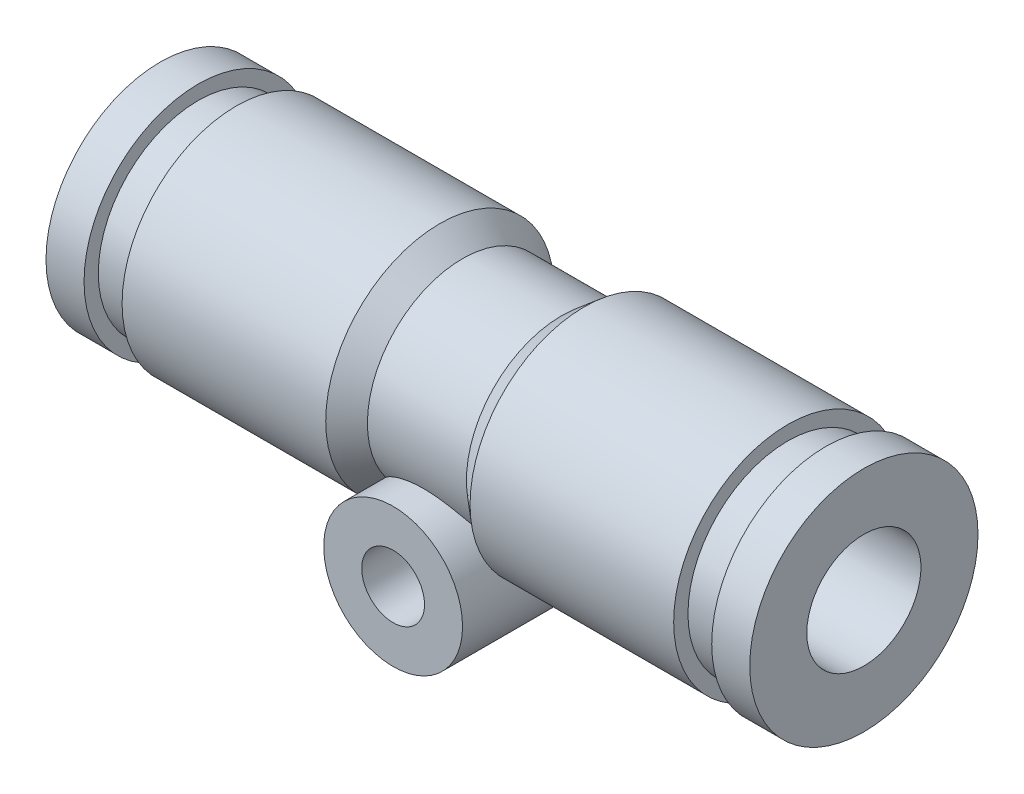
ISO-10303-21;
HEADER;
FILE_DESCRIPTION(('STEP AP214'),'2;1');
FILE_NAME('part.step','',(''),(''),'','','');
FILE_SCHEMA(('AUTOMOTIVE_DESIGN { 1 0 10303 214 1 1 1 1 }'));
ENDSEC;
DATA;
#1=APPLICATION_CONTEXT('core data for automotive mechanical design processes');
#2=APPLICATION_PROTOCOL_DEFINITION('international standard','automotive_design',2000,#1);
#3=PRODUCT_CONTEXT('',#1,'mechanical');
#4=PRODUCT('Part','Part','',(#3));
#5=PRODUCT_RELATED_PRODUCT_CATEGORY('part','',(#4));
#6=PRODUCT_DEFINITION_FORMATION('','',#4);
#7=PRODUCT_DEFINITION_CONTEXT('part definition',#1,'design');
#8=PRODUCT_DEFINITION('design','',#6,#7);
#9=PRODUCT_DEFINITION_SHAPE('','',#8);
#10=(LENGTH_UNIT() NAMED_UNIT(*) SI_UNIT(.MILLI.,.METRE.));
#11=(NAMED_UNIT(*) PLANE_ANGLE_UNIT() SI_UNIT($,.RADIAN.));
#12=(NAMED_UNIT(*) SI_UNIT($,.STERADIAN.) SOLID_ANGLE_UNIT());
#13=UNCERTAINTY_MEASURE_WITH_UNIT(LENGTH_MEASURE(1.E-05),#10,'distance_accuracy_value','');
#14=(GEOMETRIC_REPRESENTATION_CONTEXT(3) GLOBAL_UNCERTAINTY_ASSIGNED_CONTEXT((#13)) GLOBAL_UNIT_ASSIGNED_CONTEXT((#10,
#11,#12)) REPRESENTATION_CONTEXT('',''));
#15=CARTESIAN_POINT('',(0.,0.,0.));
#16=DIRECTION('',(0.,0.,1.));
#17=DIRECTION('',(1.,0.,0.));
#18=AXIS2_PLACEMENT_3D('',#15,#16,#17);
#19=CARTESIAN_POINT('',(0.,0.,0.));
#20=DIRECTION('',(-1.,0.,0.));
#21=DIRECTION('',(0.,0.,1.));
#22=AXIS2_PLACEMENT_3D('',#19,#20,#21);
#23=CYLINDRICAL_SURFACE('',#22,3.);
#24=CARTESIAN_POINT('',(-18.5,0.,0.));
#25=DIRECTION('',(-1.,0.,0.));
#26=DIRECTION('',(0.,0.,1.));
#27=AXIS2_PLACEMENT_3D('',#24,#25,#26);
#28=CIRCLE('',#27,3.);
#29=CARTESIAN_POINT('',(-18.5,0.,3.));
#30=VERTEX_POINT('',#29);
#31=EDGE_CURVE('E28',#30,#30,#28,.T.);
#32=ORIENTED_EDGE('',*,*,#31,.T.);
#33=EDGE_LOOP('',(#32));
#34=FACE_BOUND('',#33,.T.);
#35=CARTESIAN_POINT('',(-0.999999999999997,0.,0.));
#36=DIRECTION('',(-1.,0.,0.));
#37=DIRECTION('',(0.,0.,1.));
#38=AXIS2_PLACEMENT_3D('',#35,#36,#37);
#39=CIRCLE('',#38,3.);
#40=CARTESIAN_POINT('',(-0.999999999999997,0.,3.));
#41=VERTEX_POINT('',#40);
#42=EDGE_CURVE('E98',#41,#41,#39,.T.);
#43=ORIENTED_EDGE('',*,*,#42,.F.);
#44=EDGE_LOOP('',(#43));
#45=FACE_BOUND('',#44,.T.);
#46=ADVANCED_FACE('F16',(#34,#45),#23,.F.);
#47=CARTESIAN_POINT('',(-0.999999999999997,-1.25,0.));
#48=DIRECTION('',(-1.,0.,0.));
#49=DIRECTION('',(0.,0.,1.));
#50=AXIS2_PLACEMENT_3D('',#47,#48,#49);
#51=PLANE('',#50);
#52=CARTESIAN_POINT('',(-0.999999999999997,0.,0.));
#53=DIRECTION('',(-1.,0.,0.));
#54=DIRECTION('',(0.,0.,1.));
#55=AXIS2_PLACEMENT_3D('',#52,#53,#54);
#56=CIRCLE('',#55,1.25);
#57=CARTESIAN_POINT('',(-0.999999999999997,0.,1.25));
#58=VERTEX_POINT('',#57);
#59=EDGE_CURVE('E92',#58,#58,#56,.T.);
#60=ORIENTED_EDGE('',*,*,#59,.F.);
#61=EDGE_LOOP('',(#60));
#62=FACE_BOUND('',#61,.T.);
#63=ORIENTED_EDGE('',*,*,#42,.T.);
#64=EDGE_LOOP('',(#63));
#65=FACE_BOUND('',#64,.T.);
#66=ADVANCED_FACE('F118',(#62,#65),#51,.T.);
#67=CARTESIAN_POINT('',(0.999999999999997,-3.,0.));
#68=DIRECTION('',(1.,0.,0.));
#69=DIRECTION('',(0.,0.,-1.));
#70=AXIS2_PLACEMENT_3D('',#67,#68,#69);
#71=PLANE('',#70);
#72=CARTESIAN_POINT('',(0.999999999999997,0.,0.));
#73=DIRECTION('',(-1.,0.,0.));
#74=DIRECTION('',(0.,0.,1.));
#75=AXIS2_PLACEMENT_3D('',#72,#73,#74);
#76=CIRCLE('',#75,1.25);
#77=CARTESIAN_POINT('',(0.999999999999997,0.,1.25));
#78=VERTEX_POINT('',#77);
#79=EDGE_CURVE('E95',#78,#78,#76,.T.);
#80=ORIENTED_EDGE('',*,*,#79,.T.);
#81=EDGE_LOOP('',(#80));
#82=FACE_BOUND('',#81,.T.);
#83=CARTESIAN_POINT('',(0.999999999999997,0.,0.));
#84=DIRECTION('',(-1.,0.,0.));
#85=DIRECTION('',(0.,0.,1.));
#86=AXIS2_PLACEMENT_3D('',#83,#84,#85);
#87=CIRCLE('',#86,3.);
#88=CARTESIAN_POINT('',(0.999999999999997,0.,3.));
#89=VERTEX_POINT('',#88);
#90=EDGE_CURVE('E90',#89,#89,#87,.T.);
#91=ORIENTED_EDGE('',*,*,#90,.F.);
#92=EDGE_LOOP('',(#91));
#93=FACE_BOUND('',#92,.T.);
#94=ADVANCED_FACE('F123',(#82,#93),#71,.T.);
#95=CARTESIAN_POINT('',(0.,0.,0.));
#96=DIRECTION('',(-1.,0.,0.));
#97=DIRECTION('',(0.,0.,1.));
#98=AXIS2_PLACEMENT_3D('',#95,#96,#97);
#99=CYLINDRICAL_SURFACE('',#98,3.);
#100=CARTESIAN_POINT('',(18.5,0.,0.));
#101=DIRECTION('',(-1.,0.,0.));
#102=DIRECTION('',(0.,0.,1.));
#103=AXIS2_PLACEMENT_3D('',#100,#101,#102);
#104=CIRCLE('',#103,3.);
#105=CARTESIAN_POINT('',(18.5,0.,3.));
#106=VERTEX_POINT('',#105);
#107=EDGE_CURVE('E88',#106,#106,#104,.T.);
#108=ORIENTED_EDGE('',*,*,#107,.F.);
#109=EDGE_LOOP('',(#108));
#110=FACE_BOUND('',#109,.T.);
#111=ORIENTED_EDGE('',*,*,#90,.T.);
#112=EDGE_LOOP('',(#111));
#113=FACE_BOUND('',#112,.T.);
#114=ADVANCED_FACE('F127',(#110,#113),#99,.F.);
#115=CARTESIAN_POINT('',(2.60240273593462,0.,0.));
#116=DIRECTION('',(1.,0.,0.));
#117=DIRECTION('',(0.,0.,-1.));
#118=AXIS2_PLACEMENT_3D('',#115,#116,#117);
#119=CONICAL_SURFACE('',#118,5.,0.698131700797734);
#120=CARTESIAN_POINT('',(3.79415632852883,0.,0.));
#121=DIRECTION('',(-1.,0.,0.));
#122=DIRECTION('',(0.,0.,1.));
#123=AXIS2_PLACEMENT_3D('',#120,#121,#122);
#124=CIRCLE('',#123,6.);
#125=CARTESIAN_POINT('',(3.79415632852883,0.,6.));
#126=VERTEX_POINT('',#125);
#127=EDGE_CURVE('E62',#126,#126,#124,.T.);
#128=ORIENTED_EDGE('',*,*,#127,.T.);
#129=EDGE_LOOP('',(#128));
#130=FACE_BOUND('',#129,.T.);
#131=CARTESIAN_POINT('',(2.60240273593462,0.,0.));
#132=DIRECTION('',(-1.,0.,0.));
#133=DIRECTION('',(0.,0.,1.));
#134=AXIS2_PLACEMENT_3D('',#131,#132,#133);
#135=CIRCLE('',#134,5.);
#136=CARTESIAN_POINT('',(2.60240273593462,-2.94070322158605,4.04379333825968));
#137=VERTEX_POINT('',#136);
#138=CARTESIAN_POINT('',(2.60240273593462,-2.94070322158605,-4.04379333825968));
#139=VERTEX_POINT('',#138);
#140=EDGE_CURVE('E57',#137,#139,#135,.T.);
#141=ORIENTED_EDGE('',*,*,#140,.F.);
#142=CARTESIAN_POINT('',(2.49744300952812,-2.83818137091215,4.00896076898988));
#143=CARTESIAN_POINT('',(2.53501750418707,-2.87343508961016,4.02262900383667));
#144=CARTESIAN_POINT('',(2.57210826251721,-2.90973367427727,4.03490478411134));
#145=CARTESIAN_POINT('',(2.64516786340097,-2.98438443938821,4.0563722232218));
#146=CARTESIAN_POINT('',(2.68113559150554,-3.02273856319636,4.0655609015829));
#147=CARTESIAN_POINT('',(2.7872300444597,-3.14096495133667,4.08805634389488));
#148=CARTESIAN_POINT('',(2.85531611531836,-3.22378500759988,4.09620513600153));
#149=CARTESIAN_POINT('',(2.98429148066433,-3.39569179818134,4.09644402968397));
#150=CARTESIAN_POINT('',(3.0451368609858,-3.48481201504061,4.08844095451283));
#151=CARTESIAN_POINT('',(3.15724988980957,-3.6654608866603,4.05500338067057));
#152=CARTESIAN_POINT('',(3.20854442438163,-3.75698192702457,4.0296187851381));
#153=CARTESIAN_POINT('',(3.29749529388649,-3.93220272676524,3.96450131569345));
#154=CARTESIAN_POINT('',(3.33587616594083,-4.01598363484378,3.92595790982199));
#155=CARTESIAN_POINT('',(3.40415391928817,-4.18009152586392,3.83599776527154));
#156=CARTESIAN_POINT('',(3.43403840092769,-4.26041331707905,3.78456241580369));
#157=CARTESIAN_POINT('',(3.49584292870839,-4.44444523929988,3.64995854714985));
#158=CARTESIAN_POINT('',(3.52442960233741,-4.54582135746169,3.56208878975451));
#159=CARTESIAN_POINT('',(3.57060621493688,-4.73648630963507,3.37161750312203));
#160=CARTESIAN_POINT('',(3.58817463816042,-4.82575122907248,3.26898762844836));
#161=CARTESIAN_POINT('',(3.61218375196865,-4.97206184822482,3.07901040980296));
#162=CARTESIAN_POINT('',(3.62027720622642,-5.03172121878027,2.99383324015471));
#163=CARTESIAN_POINT('',(3.63304652084302,-5.14408528747018,2.818725139703));
#164=CARTESIAN_POINT('',(3.63772058392586,-5.19678631630221,2.72879173555132));
#165=CARTESIAN_POINT('',(3.64460807110085,-5.2955825562105,2.54511488831913));
#166=CARTESIAN_POINT('',(3.64681742697528,-5.3416667366994,2.45136540999105));
#167=CARTESIAN_POINT('',(3.64953110913271,-5.42746958618297,2.26096244544423));
#168=CARTESIAN_POINT('',(3.6500349121993,-5.46718629825556,2.16430807725801));
#169=CARTESIAN_POINT('',(3.64994182872684,-5.55956407798054,1.91804561170994));
#170=CARTESIAN_POINT('',(3.64863946225077,-5.60827093662262,1.76694624840167));
#171=CARTESIAN_POINT('',(3.64515791696607,-5.69259412530791,1.461127029615));
#172=CARTESIAN_POINT('',(3.64297831019459,-5.72820404974301,1.30640544177848));
#173=CARTESIAN_POINT('',(3.63882013259333,-5.78697692577252,0.994475637312486));
#174=CARTESIAN_POINT('',(3.63684175154837,-5.81012821376136,0.837265231902721));
#175=CARTESIAN_POINT('',(3.63376196155267,-5.8443346580604,0.521564457018854));
#176=CARTESIAN_POINT('',(3.63266040261534,-5.85539188326602,0.363074311140703));
#177=CARTESIAN_POINT('',(3.63163234521959,-5.86575371374293,0.0412124786688938));
#178=CARTESIAN_POINT('',(3.63174000470868,-5.86471664908859,-0.122170351232936));
#179=CARTESIAN_POINT('',(3.63318399983668,-5.85004149934189,-0.448397826548533));
#180=CARTESIAN_POINT('',(3.63452055921515,-5.83640111962571,-0.611242368540477));
#181=CARTESIAN_POINT('',(3.63801004363454,-5.7962904564564,-0.935158186539589));
#182=CARTESIAN_POINT('',(3.64016206244485,-5.76983440617097,-1.09623122750467));
#183=CARTESIAN_POINT('',(3.64446880143453,-5.70361376796655,-1.41559224160734));
#184=CARTESIAN_POINT('',(3.64662352006533,-5.66385487554975,-1.57388137617598));
#185=CARTESIAN_POINT('',(3.64910068679437,-5.58651732721466,-1.83204458201322));
#186=CARTESIAN_POINT('',(3.64979946423505,-5.55296787317778,-1.93313245080637));
#187=CARTESIAN_POINT('',(3.65012789552069,-5.47959807335785,-2.13299949166707));
#188=CARTESIAN_POINT('',(3.64975779813376,-5.43977918875084,-2.23177919553873));
#189=CARTESIAN_POINT('',(3.64731714412769,-5.35358759801863,-2.42632071197188));
#190=CARTESIAN_POINT('',(3.64524826308699,-5.30722138708189,-2.52208540176093));
#191=CARTESIAN_POINT('',(3.63860953443154,-5.20758216844159,-2.7098300235428));
#192=CARTESIAN_POINT('',(3.63404055333255,-5.15431155862936,-2.80181125498459));
#193=CARTESIAN_POINT('',(3.61895200842227,-5.01827072323123,-3.01597397930093));
#194=CARTESIAN_POINT('',(3.60680619551761,-4.93210045228504,-3.13593514822385));
#195=CARTESIAN_POINT('',(3.57236643864194,-4.74522030625738,-3.36236483623995));
#196=CARTESIAN_POINT('',(3.55008967542119,-4.64453524298676,-3.46885580979177));
#197=CARTESIAN_POINT('',(3.49847569948111,-4.45586254291758,-3.63884667553587));
#198=CARTESIAN_POINT('',(3.47220273062776,-4.37080209672166,-3.70648865485246));
#199=CARTESIAN_POINT('',(3.40980067586467,-4.19444346556984,-3.82769258683602));
#200=CARTESIAN_POINT('',(3.37368147324241,-4.10315160399353,-3.88126855315067));
#201=CARTESIAN_POINT('',(3.29017096164279,-3.9164002959484,-3.97184414467173));
#202=CARTESIAN_POINT('',(3.24269376275994,-3.82091385427079,-4.0087109465928));
#203=CARTESIAN_POINT('',(3.13680006836322,-3.63055708866317,-4.06351045408079));
#204=CARTESIAN_POINT('',(3.07838544166453,-3.53568666233919,-4.08144639078577));
#205=CARTESIAN_POINT('',(2.95951793934521,-3.36140231208487,-4.09779266541949));
#206=CARTESIAN_POINT('',(2.90007660270723,-3.28146745267984,-4.09821582281753));
#207=CARTESIAN_POINT('',(2.77540135321448,-3.12735078523216,-4.08602815177606));
#208=CARTESIAN_POINT('',(2.71016773330866,-3.05316868659452,-4.07341798216373));
#209=CARTESIAN_POINT('',(2.61909220434669,-2.95754947057032,-4.04887659914003));
#210=CARTESIAN_POINT('',(2.59504690563153,-2.93301627347318,-4.04177637612477));
#211=CARTESIAN_POINT('',(2.54655180928172,-2.88490280423067,-4.02630240294381));
#212=CARTESIAN_POINT('',(2.52210326530158,-2.86132015923841,-4.01793210918921));
#213=CARTESIAN_POINT('',(2.49744300952808,-2.83818137091211,-4.00896076898986));
#214=B_SPLINE_CURVE_WITH_KNOTS('',3,(#142,#143,#144,#145,#146,#147,#148,#149,#150,#151,#152,
#153,#154,#155,#156,#157,#158,#159,#160,#161,#162,#163,#164,#165,#166,#167,#168,#169,#170,#171,
#172,#173,#174,#175,#176,#177,#178,#179,#180,#181,#182,#183,#184,#185,#186,#187,#188,#189,#190,
#191,#192,#193,#194,#195,#196,#197,#198,#199,#200,#201,#202,#203,#204,#205,#206,#207,#208,#209,
#210,#211,#212,#213),.UNSPECIFIED.,.F.,.F.,(4,2,2,2,2,2,2,2,2,2,2,2,2,2,2,2,2,2,2,2,2,2,2,2,2,2,
2,2,2,2,2,2,2,2,2,4),(0.,0.159861657195411,0.319877213922793,0.640885041432728,
0.963749988909762,1.28569184180627,1.58401129623719,1.88276390983401,2.29198571781765,
2.70200416048555,3.01451092696199,3.32718183322991,3.64036807044289,3.95365037582539,
4.42923999617566,4.90506191533546,5.38132852094173,5.85751364028413,6.34718307534837,
6.8369416796985,7.32615759767635,7.81516432934133,8.13451621891985,8.4537937890716,
8.77275682070262,9.09160937212112,9.53487640939303,9.97739451160665,10.3115628707665,
10.6453970313007,10.9818402413165,11.3182260175949,11.6158273906529,11.9134137208684,
12.0186226637276,12.1235502593469),.UNSPECIFIED.);
#215=EDGE_CURVE('E60',#137,#139,#214,.T.);
#216=ORIENTED_EDGE('',*,*,#215,.T.);
#217=EDGE_LOOP('',(#141,#216));
#218=FACE_BOUND('',#217,.T.);
#219=ADVANCED_FACE('F132',(#130,#218),#119,.T.);
#220=CARTESIAN_POINT('',(0.,0.,0.));
#221=DIRECTION('',(-1.,0.,0.));
#222=DIRECTION('',(0.,0.,1.));
#223=AXIS2_PLACEMENT_3D('',#220,#221,#222);
#224=CYLINDRICAL_SURFACE('',#223,5.);
#225=ORIENTED_EDGE('',*,*,#140,.T.);
#226=CARTESIAN_POINT('',(3.61559123795818,-5.,0.));
#227=CARTESIAN_POINT('',(3.61559392836513,-4.99999866396236,-0.155457231632362));
#228=CARTESIAN_POINT('',(3.61461037725635,-4.99274075629188,-0.310974476555238));
#229=CARTESIAN_POINT('',(3.61042342612615,-4.9637619832313,-0.620719266113124));
#230=CARTESIAN_POINT('',(3.60721828070504,-4.94202974658309,-0.774945700131604));
#231=CARTESIAN_POINT('',(3.59780038768312,-4.88421303799708,-1.08111274387874));
#232=CARTESIAN_POINT('',(3.59157811139265,-4.84808316034094,-1.23304452844771));
#233=CARTESIAN_POINT('',(3.57485468569958,-4.76186613359081,-1.53261535223179));
#234=CARTESIAN_POINT('',(3.56435499858971,-4.71178375620207,-1.68025584002544));
#235=CARTESIAN_POINT('',(3.538898317125,-4.60481511859157,-1.95310399306702));
#236=CARTESIAN_POINT('',(3.52459251455064,-4.54937295937857,-2.07893931811156));
#237=CARTESIAN_POINT('',(3.4898044120678,-4.42868842736107,-2.32496959725506));
#238=CARTESIAN_POINT('',(3.46932173498715,-4.3634454562217,-2.44516420640266));
#239=CARTESIAN_POINT('',(3.42062053434761,-4.22435728823172,-2.67827645728095));
#240=CARTESIAN_POINT('',(3.39242841147254,-4.15054193468432,-2.79121733803476));
#241=CARTESIAN_POINT('',(3.32657184692375,-3.99550719630739,-3.00894503767932));
#242=CARTESIAN_POINT('',(3.28891240510304,-3.91429173399058,-3.11373612248777));
#243=CARTESIAN_POINT('',(3.21611033425859,-3.77276985437259,-3.28241517190016));
#244=CARTESIAN_POINT('',(3.18389856529676,-3.71391701102772,-3.34880521636752));
#245=CARTESIAN_POINT('',(3.11383032029431,-3.59438813600444,-3.47678456636732));
#246=CARTESIAN_POINT('',(3.0759751653722,-3.53371253368195,-3.53837499036765));
#247=CARTESIAN_POINT('',(2.9942934851908,-3.41143376833593,-3.65641081901893));
#248=CARTESIAN_POINT('',(2.9504693886655,-3.34983099159724,-3.71285830079762));
#249=CARTESIAN_POINT('',(2.85663424578769,-3.22664695242005,-3.82039716097935));
#250=CARTESIAN_POINT('',(2.80662298602488,-3.16506569079717,-3.87148835451865));
#251=CARTESIAN_POINT('',(2.70017727112448,-3.04273742181057,-3.96835734612463));
#252=CARTESIAN_POINT('',(2.64371966249634,-2.98199435965761,-4.01411471717468));
#253=CARTESIAN_POINT('',(2.52466515164763,-2.86263965775499,-4.10008599557794));
#254=CARTESIAN_POINT('',(2.46206841017621,-2.80402796225194,-4.140300048013));
#255=CARTESIAN_POINT('',(2.33101418555348,-2.68994268522528,-4.21531402432909));
#256=CARTESIAN_POINT('',(2.26255539041184,-2.63446981084151,-4.25011273126212));
#257=CARTESIAN_POINT('',(2.12022165310462,-2.52761400382818,-4.31451748210914));
#258=CARTESIAN_POINT('',(2.04634687748925,-2.47623094553139,-4.34412368560616));
#259=CARTESIAN_POINT('',(1.89837909901268,-2.3813617698121,-4.39680329395962));
#260=CARTESIAN_POINT('',(1.82457434330042,-2.33758512702422,-4.42016504979831));
#261=CARTESIAN_POINT('',(1.67313934467556,-2.25491934370792,-4.46290326519465));
#262=CARTESIAN_POINT('',(1.59550786804239,-2.21603179394198,-4.48227842893484));
#263=CARTESIAN_POINT('',(1.43699950167707,-2.14364448986514,-4.51734504745697));
#264=CARTESIAN_POINT('',(1.35612349358654,-2.11014328414031,-4.53303749511583));
#265=CARTESIAN_POINT('',(1.19162718998943,-2.04887970552361,-4.56105552030421));
#266=CARTESIAN_POINT('',(1.10800586557499,-2.02111951340696,-4.57337981898172));
#267=CARTESIAN_POINT('',(0.936152095418676,-1.97092609574487,-4.59523908047158));
#268=CARTESIAN_POINT('',(0.84785623851784,-1.94867027817371,-4.60468300016214));
#269=CARTESIAN_POINT('',(0.66955723440838,-1.91077957819877,-4.62053498140425));
#270=CARTESIAN_POINT('',(0.579553504641636,-1.89514699900353,-4.62694198697112));
#271=CARTESIAN_POINT('',(0.398471073457957,-1.87066556045264,-4.63689392361183));
#272=CARTESIAN_POINT('',(0.307392359029185,-1.86181678329522,-4.640438820006));
#273=CARTESIAN_POINT('',(0.124761828135672,-1.85098603544662,-4.64476959070513));
#274=CARTESIAN_POINT('',(0.0332100027105565,-1.84900419529107,-4.64555541256204));
#275=CARTESIAN_POINT('',(-0.153059700365814,-1.85197896520038,-4.6443705134828));
#276=CARTESIAN_POINT('',(-0.247773034576832,-1.85718765926803,-4.64229964531536));
#277=CARTESIAN_POINT('',(-0.436363737220321,-1.87494078997109,-4.6351578318012));
#278=CARTESIAN_POINT('',(-0.530241372647507,-1.88748279157443,-4.6300878822959));
#279=CARTESIAN_POINT('',(-0.716567524862344,-1.91978006769912,-4.61678994329093));
#280=CARTESIAN_POINT('',(-0.809015356368987,-1.93953869578025,-4.6085604854795));
#281=CARTESIAN_POINT('',(-0.991725288828305,-1.98604732633018,-4.5887094564556));
#282=CARTESIAN_POINT('',(-1.08198825413691,-2.01279451297529,-4.57708925122028));
#283=CARTESIAN_POINT('',(-1.25965154812003,-2.07296488962359,-4.55015404043024));
#284=CARTESIAN_POINT('',(-1.34705311369296,-2.10638514949147,-4.53484065593311));
#285=CARTESIAN_POINT('',(-1.51832853672154,-2.17948139938541,-4.5001661469714));
#286=CARTESIAN_POINT('',(-1.60220379283209,-2.21915487894519,-4.48080664587986));
#287=CARTESIAN_POINT('',(-1.76578785801998,-2.30422314346795,-4.4376602216486));
#288=CARTESIAN_POINT('',(-1.84549768371003,-2.34961652312209,-4.41387438532268));
#289=CARTESIAN_POINT('',(-2.00015148787307,-2.44546748637292,-4.36149850380934));
#290=CARTESIAN_POINT('',(-2.07509567869436,-2.49592484406899,-4.33290867288652));
#291=CARTESIAN_POINT('',(-2.21689372613641,-2.59909093956573,-4.2717888693983));
#292=CARTESIAN_POINT('',(-2.28394755926951,-2.65163929968223,-4.23945187711831));
#293=CARTESIAN_POINT('',(-2.41275260234536,-2.75988974730383,-4.16979026323232));
#294=CARTESIAN_POINT('',(-2.47450202564161,-2.81559288700972,-4.13246397185264));
#295=CARTESIAN_POINT('',(-2.59233820785671,-2.92920682661712,-4.05272241910852));
#296=CARTESIAN_POINT('',(-2.64842848619343,-2.98711622318877,-4.01031035695221));
#297=CARTESIAN_POINT('',(-2.75484855027419,-3.10425899283475,-3.92033576932669));
#298=CARTESIAN_POINT('',(-2.80517620018365,-3.16349284714016,-3.87277134683895));
#299=CARTESIAN_POINT('',(-2.89890819199506,-3.28091449368538,-3.77377151082156));
#300=CARTESIAN_POINT('',(-2.9424482852676,-3.33909383077758,-3.72245447190469));
#301=CARTESIAN_POINT('',(-3.02413185187595,-3.45496733551345,-3.61516999941971));
#302=CARTESIAN_POINT('',(-3.06227340734468,-3.51266132392165,-3.55920092433623));
#303=CARTESIAN_POINT('',(-3.16890977770537,-3.68380827989724,-3.38466984370044));
#304=CARTESIAN_POINT('',(-3.22966872198657,-3.79539428951194,-3.25942767851332));
#305=CARTESIAN_POINT('',(-3.33781074862885,-4.01739225509893,-2.9824144695438));
#306=CARTESIAN_POINT('',(-3.38358406989687,-4.12686933914501,-2.82928615130687));
#307=CARTESIAN_POINT('',(-3.45883628959411,-4.32925887683519,-2.5086812159727));
#308=CARTESIAN_POINT('',(-3.48830492796947,-4.42216087541632,-2.34119564065375));
#309=CARTESIAN_POINT('',(-3.52587672049576,-4.55484406424309,-2.06554333895026));
#310=CARTESIAN_POINT('',(-3.53779925945988,-4.60090055257707,-1.96082560758362));
#311=CARTESIAN_POINT('',(-3.55830559912619,-4.68582893829457,-1.74817093601044));
#312=CARTESIAN_POINT('',(-3.5668890645619,-4.7247001140166,-1.64023367371123));
#313=CARTESIAN_POINT('',(-3.58144333249171,-4.79498101608284,-1.42173810781208));
#314=CARTESIAN_POINT('',(-3.5874129093717,-4.82638723907151,-1.31117860023655));
#315=CARTESIAN_POINT('',(-3.59732889556528,-4.88152716118984,-1.0880708651819));
#316=CARTESIAN_POINT('',(-3.60127517713173,-4.90526037582495,-0.975522512594762));
#317=CARTESIAN_POINT('',(-3.60810060679576,-4.94804331749473,-0.731150854730216));
#318=CARTESIAN_POINT('',(-3.61071348790874,-4.96576507877384,-0.599085756349465));
#319=CARTESIAN_POINT('',(-3.61430239148231,-4.99061356143543,-0.333933200295242));
#320=CARTESIAN_POINT('',(-3.61527825153673,-4.9977392315892,-0.200845642500855));
#321=CARTESIAN_POINT('',(-3.61577759853996,-5.00134553614766,0.0655540604669429));
#322=CARTESIAN_POINT('',(-3.61530025375918,-4.99782007447534,0.198866290592681));
#323=CARTESIAN_POINT('',(-3.61279939399536,-4.98013517006533,0.464766995140445));
#324=CARTESIAN_POINT('',(-3.61077589021604,-4.96597580438258,0.597355474799868));
#325=CARTESIAN_POINT('',(-3.60468493267071,-4.9262669885348,0.866736950168788));
#326=CARTESIAN_POINT('',(-3.60053154717243,-4.90024424693102,1.0034585912426));
#327=CARTESIAN_POINT('',(-3.58940947203136,-4.83692237524988,1.27416872063261));
#328=CARTESIAN_POINT('',(-3.58244047977239,-4.79962203318547,1.40815691353627));
#329=CARTESIAN_POINT('',(-3.56465656968925,-4.71410619926503,1.67226109803404));
#330=CARTESIAN_POINT('',(-3.55384392422128,-4.66589716270366,1.80237932838953));
#331=CARTESIAN_POINT('',(-3.52706055054513,-4.55905584576871,2.05770383115314));
#332=CARTESIAN_POINT('',(-3.51109115381562,-4.50042625774761,2.18291136216047));
#333=CARTESIAN_POINT('',(-3.47660798062919,-4.3871655795525,2.4009281554489));
#334=CARTESIAN_POINT('',(-3.45938190106291,-4.33439053355238,2.49490969429399));
#335=CARTESIAN_POINT('',(-3.41997815751928,-4.22339629237382,2.67851128655262));
#336=CARTESIAN_POINT('',(-3.39780155667296,-4.16517826764007,2.76813227137551));
#337=CARTESIAN_POINT('',(-3.3476654281464,-4.04400192721565,2.94232835379054));
#338=CARTESIAN_POINT('',(-3.31971011521749,-3.98104708752607,3.026907071397));
#339=CARTESIAN_POINT('',(-3.25718085217083,-3.85122419860509,3.1904498027411));
#340=CARTESIAN_POINT('',(-3.22260682085394,-3.78435610137242,3.26941374757983));
#341=CARTESIAN_POINT('',(-3.14574047051557,-3.64714936128267,3.42182884635311));
#342=CARTESIAN_POINT('',(-3.10337831657718,-3.57678389805399,3.49522086796028));
#343=CARTESIAN_POINT('',(-3.01056665592987,-3.43452247174789,3.63510752483649));
#344=CARTESIAN_POINT('',(-2.96011711680147,-3.36262650253621,3.70160213245445));
#345=CARTESIAN_POINT('',(-2.85082918834137,-3.21890056589313,3.82724249666443));
#346=CARTESIAN_POINT('',(-2.79199714740493,-3.14707058954296,3.88639375179499));
#347=CARTESIAN_POINT('',(-2.66587417499562,-3.00508033756522,3.99719927265386));
#348=CARTESIAN_POINT('',(-2.59858467983999,-2.93491978082308,4.04885480816764));
#349=CARTESIAN_POINT('',(-2.46671505223356,-2.80837365321898,4.13739831812852));
#350=CARTESIAN_POINT('',(-2.40328569706114,-2.75151866360814,4.1753370839022));
#351=CARTESIAN_POINT('',(-2.27087334185639,-2.64114352957691,4.24601639847264));
#352=CARTESIAN_POINT('',(-2.20189063326277,-2.58762321041496,4.27875721978865));
#353=CARTESIAN_POINT('',(-2.05880988385994,-2.484777688467,4.33929065206399));
#354=CARTESIAN_POINT('',(-1.98471139733715,-2.43545285205133,4.36708283111459));
#355=CARTESIAN_POINT('',(-1.83193753721114,-2.3417510794232,4.41803655330558));
#356=CARTESIAN_POINT('',(-1.75326211309541,-2.29737419783368,4.44119804532776));
#357=CARTESIAN_POINT('',(-1.5954295053418,-2.21600262439178,4.48233452096926));
#358=CARTESIAN_POINT('',(-1.51644174444935,-2.17877097548935,4.50049111385609));
#359=CARTESIAN_POINT('',(-1.35536197223948,-2.10983994155072,4.53321335321118));
#360=CARTESIAN_POINT('',(-1.27326896187355,-2.07814235572139,4.54777783246214));
#361=CARTESIAN_POINT('',(-1.0232112932695,-1.99193327875088,4.58652807201476));
#362=CARTESIAN_POINT('',(-0.851325219039576,-1.946231446405,4.60580621908193));
#363=CARTESIAN_POINT('',(-0.494730622295063,-1.87893796146454,4.63367870285096));
#364=CARTESIAN_POINT('',(-0.30978594134934,-1.85842447271344,4.64179695207392));
#365=CARTESIAN_POINT('',(0.061372867483442,-1.84580340128353,4.64683566392483));
#366=CARTESIAN_POINT('',(0.247587283838086,-1.8537025038036,4.64375349120364));
#367=CARTESIAN_POINT('',(0.526131383840618,-1.88686049179173,4.63031890379684));
#368=CARTESIAN_POINT('',(0.620026735570177,-1.90179405784531,4.62423714271528));
#369=CARTESIAN_POINT('',(0.806102479631115,-1.93886550639645,4.60881945315822));
#370=CARTESIAN_POINT('',(0.898283509222801,-1.96100065289814,4.599484760428));
#371=CARTESIAN_POINT('',(1.08028181897686,-2.0122448154011,4.5772968352969));
#372=CARTESIAN_POINT('',(1.17009830061278,-2.04135615462101,4.56444243055423));
#373=CARTESIAN_POINT('',(1.34662139315949,-2.10619012523228,4.5348905042631));
#374=CARTESIAN_POINT('',(1.43332930828736,-2.14190994431129,4.51819461676685));
#375=CARTESIAN_POINT('',(1.60180928962059,-2.21896847361547,4.48084643405));
#376=CARTESIAN_POINT('',(1.683633366077,-2.26022177357327,4.46025263029354));
#377=CARTESIAN_POINT('',(1.84297467424287,-2.34814027264491,4.41459943919662));
#378=CARTESIAN_POINT('',(1.92049366981374,-2.39480323077539,4.38954189869387));
#379=CARTESIAN_POINT('',(2.07065063747505,-2.49285130129232,4.3346103911678));
#380=CARTESIAN_POINT('',(2.14329019839442,-2.54423486353786,4.30473800281916));
#381=CARTESIAN_POINT('',(2.28320112908375,-2.65092452470442,4.23986959100684));
#382=CARTESIAN_POINT('',(2.3504727256221,-2.70623045773917,4.204873784158));
#383=CARTESIAN_POINT('',(2.47644445920835,-2.8173761830625,4.13117915136142));
#384=CARTESIAN_POINT('',(2.5353899157127,-2.87308857873394,4.09270702274372));
#385=CARTESIAN_POINT('',(2.64777658131951,-2.98640706221929,4.01076820921022));
#386=CARTESIAN_POINT('',(2.70121595250574,-3.04401377394086,3.96729986674882));
#387=CARTESIAN_POINT('',(2.80243895438613,-3.16017736146101,3.87540453652564));
#388=CARTESIAN_POINT('',(2.85022461122911,-3.21873388826288,3.82697933685182));
#389=CARTESIAN_POINT('',(2.94020909864903,-3.33594526228564,3.72525087917243));
#390=CARTESIAN_POINT('',(2.98240579655623,-3.39460013843927,3.67194577210774));
#391=CARTESIAN_POINT('',(3.06152400737815,-3.51139050366022,3.56043235188959));
#392=CARTESIAN_POINT('',(3.09842211546323,-3.56952268548509,3.50220398683338));
#393=CARTESIAN_POINT('',(3.16701824059848,-3.68424492066524,3.3813165897881));
#394=CARTESIAN_POINT('',(3.19871439079657,-3.74083441433945,3.31865597867117));
#395=CARTESIAN_POINT('',(3.28652565078688,-3.90721323463985,3.124520120997));
#396=CARTESIAN_POINT('',(3.33540669789223,-4.01367926392321,2.9868283403944));
#397=CARTESIAN_POINT('',(3.42268232646658,-4.22616846019754,2.67933764452536));
#398=CARTESIAN_POINT('',(3.45891370150661,-4.33036639351841,2.50768779950485));
#399=CARTESIAN_POINT('',(3.51684760138532,-4.5181796083859,2.15098515848957));
#400=CARTESIAN_POINT('',(3.53853288494411,-4.60177039063474,1.96591674440715));
#401=CARTESIAN_POINT('',(3.56531676212002,-4.71708666313083,1.66250712897687));
#402=CARTESIAN_POINT('',(3.57357972480145,-4.75617095554524,1.54715510455191));
#403=CARTESIAN_POINT('',(3.5873825925092,-4.82586617686364,1.31371266354163));
#404=CARTESIAN_POINT('',(3.59292187748789,-4.85647517566733,1.19562162981978));
#405=CARTESIAN_POINT('',(3.6019246058795,-4.90894631761472,0.957641723765671));
#406=CARTESIAN_POINT('',(3.60539130317154,-4.9308221534341,0.837755974039337));
#407=CARTESIAN_POINT('',(3.61073398869736,-4.96575781317957,0.596714301709803));
#408=CARTESIAN_POINT('',(3.61261068951744,-4.97882158585899,0.475558972764802));
#409=CARTESIAN_POINT('',(3.61442565335149,-4.99162846613808,0.295188423554203));
#410=CARTESIAN_POINT('',(3.61486446331481,-4.99476689013853,0.236201364884588));
#411=CARTESIAN_POINT('',(3.61544676313012,-4.99895304345355,0.118145766042288));
#412=CARTESIAN_POINT('',(3.61559021554352,-5.00000050772411,0.0590772164895468));
#413=CARTESIAN_POINT('',(3.61559123795818,-5.,0.));
#414=B_SPLINE_CURVE_WITH_KNOTS('',3,(#226,#227,#228,#229,#230,#231,#232,#233,#234,#235,#236,
#237,#238,#239,#240,#241,#242,#243,#244,#245,#246,#247,#248,#249,#250,#251,#252,#253,#254,#255,
#256,#257,#258,#259,#260,#261,#262,#263,#264,#265,#266,#267,#268,#269,#270,#271,#272,#273,#274,
#275,#276,#277,#278,#279,#280,#281,#282,#283,#284,#285,#286,#287,#288,#289,#290,#291,#292,#293,
#294,#295,#296,#297,#298,#299,#300,#301,#302,#303,#304,#305,#306,#307,#308,#309,#310,#311,#312,
#313,#314,#315,#316,#317,#318,#319,#320,#321,#322,#323,#324,#325,#326,#327,#328,#329,#330,#331,
#332,#333,#334,#335,#336,#337,#338,#339,#340,#341,#342,#343,#344,#345,#346,#347,#348,#349,#350,
#351,#352,#353,#354,#355,#356,#357,#358,#359,#360,#361,#362,#363,#364,#365,#366,#367,#368,#369,
#370,#371,#372,#373,#374,#375,#376,#377,#378,#379,#380,#381,#382,#383,#384,#385,#386,#387,#388,
#389,#390,#391,#392,#393,#394,#395,#396,#397,#398,#399,#400,#401,#402,#403,#404,#405,#406,#407,
#408,#409,#410,#411,#412,#413),.UNSPECIFIED.,.T.,.F.,(4,2,2,2,2,2,2,2,2,2,2,2,2,2,2,2,2,2,2,2,2,
2,2,2,2,2,2,2,2,2,2,2,2,2,2,2,2,2,2,2,2,2,2,2,2,2,2,2,2,2,2,2,2,2,2,2,2,2,2,2,2,2,2,2,2,2,2,2,2,
2,2,2,2,2,2,2,2,2,2,2,2,2,2,2,2,2,2,2,2,2,2,2,2,4),(0.,0.466303322518357,0.932973412976176,
1.40112703416508,1.86912074461291,2.28331267504489,2.69752990197905,3.11034604784793,
3.52294463477582,3.80582983734611,4.08864892008778,4.37135326697322,4.65406736773814,
4.93783088884046,5.22158698176452,5.50540674916612,5.78921779230578,6.05571490924028,
6.32229851307065,6.58881016197532,6.85542286250696,7.12975117100591,7.40417479809408,
7.67860175027626,7.95303391909284,8.23733523347736,8.52154219889555,8.8058814034187,
9.09010621844484,9.37420650420152,9.65819302200538,9.94210990337413,10.226014125029,
10.4990385761914,10.7721546305704,11.0450997735599,11.3181457544698,11.584724305281,
11.8513973234931,12.384438683866,12.9635465057276,13.5430183297233,13.887794142331,
14.2326045639263,14.5775764894051,14.9225701930945,15.3219453471219,15.721360120158,
16.1210035378522,16.5206440596954,16.937850653239,17.355102099305,17.7721072767066,
18.1890048689042,18.5161601166434,18.8432451748309,19.1700925072838,19.4969438497909,
19.8268832271247,20.1568239271023,20.4865160653557,20.8161522879328,21.0955364995197,
21.374906058634,21.6542999886897,21.933697002809,22.2009557909742,22.4683013078272,
23.0025039967225,23.5588546806029,24.1153362768031,24.4008628045326,24.6862809825801,
24.9717943432868,25.2571864789207,25.5385941343767,25.8198856288,26.1010850813143,
26.3822726483287,26.6512537717482,26.9203243914219,27.189298288991,27.4583745294027,
27.728604996805,27.998932232074,28.5392872886598,29.1492784805201,29.7599914148677,
30.1259011641566,30.4918941746016,30.8573110715192,31.2225641133395,31.399747321974,
31.5769529884132),.UNSPECIFIED.);
#415=CARTESIAN_POINT('',(-2.60240273593277,-2.94070322158194,-4.04379333826076));
#416=VERTEX_POINT('',#415);
#417=EDGE_CURVE('E41',#139,#416,#414,.T.);
#418=ORIENTED_EDGE('',*,*,#417,.T.);
#419=CARTESIAN_POINT('',(-2.60240273593462,0.,0.));
#420=DIRECTION('',(-1.,0.,0.));
#421=DIRECTION('',(0.,0.,1.));
#422=AXIS2_PLACEMENT_3D('',#419,#420,#421);
#423=CIRCLE('',#422,5.);
#424=CARTESIAN_POINT('',(-2.60240273593462,-2.94070322158605,4.04379333825968));
#425=VERTEX_POINT('',#424);
#426=EDGE_CURVE('E53',#425,#416,#423,.T.);
#427=ORIENTED_EDGE('',*,*,#426,.F.);
#428=EDGE_CURVE('E40',#425,#137,#414,.T.);
#429=ORIENTED_EDGE('',*,*,#428,.T.);
#430=EDGE_LOOP('',(#225,#418,#427,#429));
#431=FACE_BOUND('',#430,.T.);
#432=ADVANCED_FACE('F52',(#431),#224,.T.);
#433=CARTESIAN_POINT('',(-3.79415632852883,0.,0.));
#434=DIRECTION('',(-1.,0.,0.));
#435=DIRECTION('',(0.,0.,1.));
#436=AXIS2_PLACEMENT_3D('',#433,#434,#435);
#437=CONICAL_SURFACE('',#436,6.,0.698131700797734);
#438=CARTESIAN_POINT('',(-3.79415632852883,0.,0.));
#439=DIRECTION('',(-1.,0.,0.));
#440=DIRECTION('',(0.,0.,1.));
#441=AXIS2_PLACEMENT_3D('',#438,#439,#440);
#442=CIRCLE('',#441,6.);
#443=CARTESIAN_POINT('',(-3.79415632852883,0.,6.));
#444=VERTEX_POINT('',#443);
#445=EDGE_CURVE('E58',#444,#444,#442,.T.);
#446=ORIENTED_EDGE('',*,*,#445,.F.);
#447=EDGE_LOOP('',(#446));
#448=FACE_BOUND('',#447,.T.);
#449=ORIENTED_EDGE('',*,*,#426,.T.);
#450=CARTESIAN_POINT('',(-2.49744300952808,-2.83818137091211,-4.00896076898986));
#451=CARTESIAN_POINT('',(-2.53501750418704,-2.87343508961013,-4.02262900383666));
#452=CARTESIAN_POINT('',(-2.57210826251718,-2.90973367427723,-4.03490478411133));
#453=CARTESIAN_POINT('',(-2.64516786340094,-2.98438443938818,-4.05637222322179));
#454=CARTESIAN_POINT('',(-2.68113559150551,-3.02273856319632,-4.0655609015829));
#455=CARTESIAN_POINT('',(-2.78723004445966,-3.14096495133663,-4.08805634389488));
#456=CARTESIAN_POINT('',(-2.85531611531833,-3.22378500759984,-4.09620513600152));
#457=CARTESIAN_POINT('',(-2.98429148066431,-3.39569179818131,-4.09644402968397));
#458=CARTESIAN_POINT('',(-3.04513686098578,-3.48481201504057,-4.08844095451284));
#459=CARTESIAN_POINT('',(-3.15724988980955,-3.66546088666027,-4.05500338067058));
#460=CARTESIAN_POINT('',(-3.20854442438161,-3.75698192702453,-4.02961878513812));
#461=CARTESIAN_POINT('',(-3.29749529388648,-3.93220272676521,-3.96450131569346));
#462=CARTESIAN_POINT('',(-3.33587616594082,-4.01598363484375,-3.92595790982201));
#463=CARTESIAN_POINT('',(-3.40415391928816,-4.18009152586389,-3.83599776527156));
#464=CARTESIAN_POINT('',(-3.43403840092768,-4.26041331707902,-3.78456241580371));
#465=CARTESIAN_POINT('',(-3.49584292870838,-4.44444523929984,-3.64995854714987));
#466=CARTESIAN_POINT('',(-3.5244296023374,-4.54582135746165,-3.56208878975454));
#467=CARTESIAN_POINT('',(-3.57060621493687,-4.73648630963503,-3.37161750312207));
#468=CARTESIAN_POINT('',(-3.58817463816042,-4.82575122907245,-3.2689876284484));
#469=CARTESIAN_POINT('',(-3.61218375196865,-4.97206184822479,-3.07901040980301));
#470=CARTESIAN_POINT('',(-3.62027720622642,-5.03172121878023,-2.99383324015476));
#471=CARTESIAN_POINT('',(-3.63304652084301,-5.14408528747015,-2.81872513970306));
#472=CARTESIAN_POINT('',(-3.63772058392586,-5.19678631630218,-2.72879173555138));
#473=CARTESIAN_POINT('',(-3.64460807110085,-5.29558255621047,-2.54511488831919));
#474=CARTESIAN_POINT('',(-3.64681742697528,-5.34166673669936,-2.45136540999112));
#475=CARTESIAN_POINT('',(-3.64953110913271,-5.42746958618294,-2.2609624454443));
#476=CARTESIAN_POINT('',(-3.6500349121993,-5.46718629825553,-2.16430807725809));
#477=CARTESIAN_POINT('',(-3.64994182872684,-5.55956407798051,-1.91804561171003));
#478=CARTESIAN_POINT('',(-3.64863946225077,-5.60827093662259,-1.76694624840175));
#479=CARTESIAN_POINT('',(-3.64515791696607,-5.69259412530789,-1.46112702961509));
#480=CARTESIAN_POINT('',(-3.64297831019459,-5.72820404974299,-1.30640544177858));
#481=CARTESIAN_POINT('',(-3.63882013259333,-5.78697692577251,-0.994475637312588));
#482=CARTESIAN_POINT('',(-3.63684175154837,-5.81012821376135,-0.837265231902826));
#483=CARTESIAN_POINT('',(-3.63376196155267,-5.84433465806039,-0.521564457018964));
#484=CARTESIAN_POINT('',(-3.63266040261534,-5.85539188326602,-0.363074311140816));
#485=CARTESIAN_POINT('',(-3.63163234521959,-5.86575371374293,-0.0412124786690116));
#486=CARTESIAN_POINT('',(-3.63174000470868,-5.86471664908859,0.122170351232816));
#487=CARTESIAN_POINT('',(-3.63318399983668,-5.8500414993419,0.448397826548409));
#488=CARTESIAN_POINT('',(-3.63452055921515,-5.83640111962572,0.611242368540351));
#489=CARTESIAN_POINT('',(-3.63801004363454,-5.79629045645642,0.935158186539459));
#490=CARTESIAN_POINT('',(-3.64016206244485,-5.76983440617099,1.09623122750454));
#491=CARTESIAN_POINT('',(-3.64446880143453,-5.70361376796658,1.4155922416072));
#492=CARTESIAN_POINT('',(-3.64662352006533,-5.66385487554979,1.57388137617584));
#493=CARTESIAN_POINT('',(-3.64910068679437,-5.5865173272147,1.83204458201309));
#494=CARTESIAN_POINT('',(-3.64979946423505,-5.55296787317783,1.93313245080624));
#495=CARTESIAN_POINT('',(-3.65012789552069,-5.47959807335789,2.13299949166696));
#496=CARTESIAN_POINT('',(-3.64975779813376,-5.43977918875089,2.23177919553862));
#497=CARTESIAN_POINT('',(-3.64731714412769,-5.35358759801867,2.42632071197179));
#498=CARTESIAN_POINT('',(-3.64524826308699,-5.30722138708194,2.52208540176084));
#499=CARTESIAN_POINT('',(-3.63860953443155,-5.20758216844164,2.70983002354272));
#500=CARTESIAN_POINT('',(-3.63404055333255,-5.1543115586294,2.80181125498452));
#501=CARTESIAN_POINT('',(-3.61895200842227,-5.01827072323127,3.01597397930087));
#502=CARTESIAN_POINT('',(-3.60680619551761,-4.93210045228509,3.13593514822379));
#503=CARTESIAN_POINT('',(-3.57236643864195,-4.74522030625742,3.3623648362399));
#504=CARTESIAN_POINT('',(-3.5500896754212,-4.6445352429868,3.46885580979172));
#505=CARTESIAN_POINT('',(-3.49847569948113,-4.45586254291763,3.63884667553584));
#506=CARTESIAN_POINT('',(-3.47220273062777,-4.3708020967217,3.70648865485243));
#507=CARTESIAN_POINT('',(-3.40980067586468,-4.19444346556988,3.82769258683599));
#508=CARTESIAN_POINT('',(-3.37368147324242,-4.10315160399357,3.88126855315065));
#509=CARTESIAN_POINT('',(-3.29017096164281,-3.91640029594844,3.97184414467171));
#510=CARTESIAN_POINT('',(-3.24269376275996,-3.82091385427083,4.00871094659279));
#511=CARTESIAN_POINT('',(-3.13680006836324,-3.63055708866321,4.06351045408079));
#512=CARTESIAN_POINT('',(-3.07838544166455,-3.53568666233922,4.08144639078577));
#513=CARTESIAN_POINT('',(-2.95951793934523,-3.3614023120849,4.09779266541949));
#514=CARTESIAN_POINT('',(-2.90007660270725,-3.28146745267987,4.09821582281753));
#515=CARTESIAN_POINT('',(-2.7754013532145,-3.12735078523218,4.08602815177606));
#516=CARTESIAN_POINT('',(-2.71016773330868,-3.05316868659455,4.07341798216374));
#517=CARTESIAN_POINT('',(-2.61909220434672,-2.95754947057034,4.04887659914004));
#518=CARTESIAN_POINT('',(-2.59504690563155,-2.9330162734732,4.04177637612478));
#519=CARTESIAN_POINT('',(-2.54655180928175,-2.8849028042307,4.02630240294382));
#520=CARTESIAN_POINT('',(-2.52210326530161,-2.86132015923844,4.01793210918922));
#521=CARTESIAN_POINT('',(-2.49744300952812,-2.83818137091215,4.00896076898988));
#522=B_SPLINE_CURVE_WITH_KNOTS('',3,(#450,#451,#452,#453,#454,#455,#456,#457,#458,#459,#460,
#461,#462,#463,#464,#465,#466,#467,#468,#469,#470,#471,#472,#473,#474,#475,#476,#477,#478,#479,
#480,#481,#482,#483,#484,#485,#486,#487,#488,#489,#490,#491,#492,#493,#494,#495,#496,#497,#498,
#499,#500,#501,#502,#503,#504,#505,#506,#507,#508,#509,#510,#511,#512,#513,#514,#515,#516,#517,
#518,#519,#520,#521),.UNSPECIFIED.,.F.,.F.,(4,2,2,2,2,2,2,2,2,2,2,2,2,2,2,2,2,2,2,2,2,2,2,2,2,2,
2,2,2,2,2,2,2,2,2,4),(0.,0.159861657195412,0.319877213922795,0.640885041432731,
0.963749988909767,1.28569184180628,1.5840112962372,1.88276390983402,2.29198571781765,
2.70200416048554,3.01451092696198,3.32718183322989,3.64036807044286,3.95365037582535,
4.42923999617561,4.90506191533541,5.38132852094167,5.85751364028406,6.3471830753483,
6.83694167969842,7.32615759767626,7.81516432934124,8.13451621891977,8.45379378907153,
8.77275682070258,9.09160937212109,9.53487640939301,9.97739451160664,10.3115628707665,
10.6453970313007,10.9818402413165,11.3182260175949,11.6158273906529,11.9134137208684,
12.0186226637276,12.1235502593469),.UNSPECIFIED.);
#523=EDGE_CURVE('E11',#416,#425,#522,.T.);
#524=ORIENTED_EDGE('',*,*,#523,.T.);
#525=EDGE_LOOP('',(#449,#524));
#526=FACE_BOUND('',#525,.T.);
#527=ADVANCED_FACE('F56',(#448,#526),#437,.T.);
#528=CARTESIAN_POINT('',(-18.5,-6.,0.));
#529=DIRECTION('',(-1.,0.,0.));
#530=DIRECTION('',(0.,0.,1.));
#531=AXIS2_PLACEMENT_3D('',#528,#529,#530);
#532=PLANE('',#531);
#533=CARTESIAN_POINT('',(-18.5,0.,0.));
#534=DIRECTION('',(-1.,0.,0.));
#535=DIRECTION('',(0.,0.,1.));
#536=AXIS2_PLACEMENT_3D('',#533,#534,#535);
#537=CIRCLE('',#536,6.);
#538=CARTESIAN_POINT('',(-18.5,0.,6.));
#539=VERTEX_POINT('',#538);
#540=EDGE_CURVE('E168',#539,#539,#537,.T.);
#541=ORIENTED_EDGE('',*,*,#540,.T.);
#542=EDGE_LOOP('',(#541));
#543=FACE_BOUND('',#542,.T.);
#544=ORIENTED_EDGE('',*,*,#31,.F.);
#545=EDGE_LOOP('',(#544));
#546=FACE_BOUND('',#545,.T.);
#547=ADVANCED_FACE('F18',(#543,#546),#532,.T.);
#548=CARTESIAN_POINT('',(0.,0.,0.));
#549=DIRECTION('',(-1.,0.,0.));
#550=DIRECTION('',(0.,0.,1.));
#551=AXIS2_PLACEMENT_3D('',#548,#549,#550);
#552=CYLINDRICAL_SURFACE('',#551,1.25);
#553=ORIENTED_EDGE('',*,*,#59,.T.);
#554=EDGE_LOOP('',(#553));
#555=FACE_BOUND('',#554,.T.);
#556=ORIENTED_EDGE('',*,*,#79,.F.);
#557=EDGE_LOOP('',(#556));
#558=FACE_BOUND('',#557,.T.);
#559=ADVANCED_FACE('F106',(#555,#558),#552,.F.);
#560=CARTESIAN_POINT('',(18.5,-3.,0.));
#561=DIRECTION('',(1.,0.,0.));
#562=DIRECTION('',(0.,0.,-1.));
#563=AXIS2_PLACEMENT_3D('',#560,#561,#562);
#564=PLANE('',#563);
#565=ORIENTED_EDGE('',*,*,#107,.T.);
#566=EDGE_LOOP('',(#565));
#567=FACE_BOUND('',#566,.T.);
#568=CARTESIAN_POINT('',(18.5,0.,0.));
#569=DIRECTION('',(-1.,0.,0.));
#570=DIRECTION('',(0.,0.,1.));
#571=AXIS2_PLACEMENT_3D('',#568,#569,#570);
#572=CIRCLE('',#571,6.);
#573=CARTESIAN_POINT('',(18.5,0.,6.));
#574=VERTEX_POINT('',#573);
#575=EDGE_CURVE('E81',#574,#574,#572,.T.);
#576=ORIENTED_EDGE('',*,*,#575,.F.);
#577=EDGE_LOOP('',(#576));
#578=FACE_BOUND('',#577,.T.);
#579=ADVANCED_FACE('F114',(#567,#578),#564,.T.);
#580=CARTESIAN_POINT('',(0.,0.,0.));
#581=DIRECTION('',(-1.,0.,0.));
#582=DIRECTION('',(0.,0.,1.));
#583=AXIS2_PLACEMENT_3D('',#580,#581,#582);
#584=CYLINDRICAL_SURFACE('',#583,6.);
#585=ORIENTED_EDGE('',*,*,#575,.T.);
#586=EDGE_LOOP('',(#585));
#587=FACE_BOUND('',#586,.T.);
#588=CARTESIAN_POINT('',(16.5,0.,0.));
#589=DIRECTION('',(-1.,0.,0.));
#590=DIRECTION('',(0.,0.,1.));
#591=AXIS2_PLACEMENT_3D('',#588,#589,#590);
#592=CIRCLE('',#591,6.);
#593=CARTESIAN_POINT('',(16.5,0.,6.));
#594=VERTEX_POINT('',#593);
#595=EDGE_CURVE('E79',#594,#594,#592,.T.);
#596=ORIENTED_EDGE('',*,*,#595,.F.);
#597=EDGE_LOOP('',(#596));
#598=FACE_BOUND('',#597,.T.);
#599=ADVANCED_FACE('F140',(#587,#598),#584,.T.);
#600=CARTESIAN_POINT('',(16.5,-5.25,0.));
#601=DIRECTION('',(-1.,0.,0.));
#602=DIRECTION('',(0.,0.,1.));
#603=AXIS2_PLACEMENT_3D('',#600,#601,#602);
#604=PLANE('',#603);
#605=ORIENTED_EDGE('',*,*,#595,.T.);
#606=EDGE_LOOP('',(#605));
#607=FACE_BOUND('',#606,.T.);
#608=CARTESIAN_POINT('',(16.5,0.,0.));
#609=DIRECTION('',(-1.,0.,0.));
#610=DIRECTION('',(0.,0.,1.));
#611=AXIS2_PLACEMENT_3D('',#608,#609,#610);
#612=CIRCLE('',#611,5.25);
#613=CARTESIAN_POINT('',(16.5,0.,5.25));
#614=VERTEX_POINT('',#613);
#615=EDGE_CURVE('E80',#614,#614,#612,.T.);
#616=ORIENTED_EDGE('',*,*,#615,.F.);
#617=EDGE_LOOP('',(#616));
#618=FACE_BOUND('',#617,.T.);
#619=ADVANCED_FACE('F143',(#607,#618),#604,.T.);
#620=CARTESIAN_POINT('',(0.,0.,0.));
#621=DIRECTION('',(-1.,0.,0.));
#622=DIRECTION('',(0.,0.,1.));
#623=AXIS2_PLACEMENT_3D('',#620,#621,#622);
#624=CYLINDRICAL_SURFACE('',#623,5.25);
#625=ORIENTED_EDGE('',*,*,#615,.T.);
#626=EDGE_LOOP('',(#625));
#627=FACE_BOUND('',#626,.T.);
#628=CARTESIAN_POINT('',(14.5,0.,0.));
#629=DIRECTION('',(-1.,0.,0.));
#630=DIRECTION('',(0.,0.,1.));
#631=AXIS2_PLACEMENT_3D('',#628,#629,#630);
#632=CIRCLE('',#631,5.25);
#633=CARTESIAN_POINT('',(14.5,0.,5.25));
#634=VERTEX_POINT('',#633);
#635=EDGE_CURVE('E72',#634,#634,#632,.T.);
#636=ORIENTED_EDGE('',*,*,#635,.F.);
#637=EDGE_LOOP('',(#636));
#638=FACE_BOUND('',#637,.T.);
#639=ADVANCED_FACE('F144',(#627,#638),#624,.T.);
#640=CARTESIAN_POINT('',(14.5,-6.,0.));
#641=DIRECTION('',(1.,0.,0.));
#642=DIRECTION('',(0.,0.,-1.));
#643=AXIS2_PLACEMENT_3D('',#640,#641,#642);
#644=PLANE('',#643);
#645=ORIENTED_EDGE('',*,*,#635,.T.);
#646=EDGE_LOOP('',(#645));
#647=FACE_BOUND('',#646,.T.);
#648=CARTESIAN_POINT('',(14.5,0.,0.));
#649=DIRECTION('',(-1.,0.,0.));
#650=DIRECTION('',(0.,0.,1.));
#651=AXIS2_PLACEMENT_3D('',#648,#649,#650);
#652=CIRCLE('',#651,6.);
#653=CARTESIAN_POINT('',(14.5,0.,6.));
#654=VERTEX_POINT('',#653);
#655=EDGE_CURVE('E75',#654,#654,#652,.T.);
#656=ORIENTED_EDGE('',*,*,#655,.F.);
#657=EDGE_LOOP('',(#656));
#658=FACE_BOUND('',#657,.T.);
#659=ADVANCED_FACE('F149',(#647,#658),#644,.T.);
#660=CARTESIAN_POINT('',(0.,0.,0.));
#661=DIRECTION('',(-1.,0.,0.));
#662=DIRECTION('',(0.,0.,1.));
#663=AXIS2_PLACEMENT_3D('',#660,#661,#662);
#664=CYLINDRICAL_SURFACE('',#663,6.);
#665=ORIENTED_EDGE('',*,*,#655,.T.);
#666=EDGE_LOOP('',(#665));
#667=FACE_BOUND('',#666,.T.);
#668=ORIENTED_EDGE('',*,*,#127,.F.);
#669=EDGE_LOOP('',(#668));
#670=FACE_BOUND('',#669,.T.);
#671=ADVANCED_FACE('F153',(#667,#670),#664,.T.);
#672=CARTESIAN_POINT('',(0.,0.,0.));
#673=DIRECTION('',(-1.,0.,0.));
#674=DIRECTION('',(0.,0.,1.));
#675=AXIS2_PLACEMENT_3D('',#672,#673,#674);
#676=CYLINDRICAL_SURFACE('',#675,6.);
#677=ORIENTED_EDGE('',*,*,#445,.T.);
#678=EDGE_LOOP('',(#677));
#679=FACE_BOUND('',#678,.T.);
#680=CARTESIAN_POINT('',(-14.5,0.,0.));
#681=DIRECTION('',(-1.,0.,0.));
#682=DIRECTION('',(0.,0.,1.));
#683=AXIS2_PLACEMENT_3D('',#680,#681,#682);
#684=CIRCLE('',#683,6.);
#685=CARTESIAN_POINT('',(-14.5,0.,6.));
#686=VERTEX_POINT('',#685);
#687=EDGE_CURVE('E65',#686,#686,#684,.T.);
#688=ORIENTED_EDGE('',*,*,#687,.F.);
#689=EDGE_LOOP('',(#688));
#690=FACE_BOUND('',#689,.T.);
#691=ADVANCED_FACE('F160',(#679,#690),#676,.T.);
#692=CARTESIAN_POINT('',(-14.5,-5.25,0.));
#693=DIRECTION('',(-1.,0.,0.));
#694=DIRECTION('',(0.,0.,1.));
#695=AXIS2_PLACEMENT_3D('',#692,#693,#694);
#696=PLANE('',#695);
#697=ORIENTED_EDGE('',*,*,#687,.T.);
#698=EDGE_LOOP('',(#697));
#699=FACE_BOUND('',#698,.T.);
#700=CARTESIAN_POINT('',(-14.5,0.,0.));
#701=DIRECTION('',(-1.,0.,0.));
#702=DIRECTION('',(0.,0.,1.));
#703=AXIS2_PLACEMENT_3D('',#700,#701,#702);
#704=CIRCLE('',#703,5.25);
#705=CARTESIAN_POINT('',(-14.5,0.,5.25));
#706=VERTEX_POINT('',#705);
#707=EDGE_CURVE('E211',#706,#706,#704,.T.);
#708=ORIENTED_EDGE('',*,*,#707,.F.);
#709=EDGE_LOOP('',(#708));
#710=FACE_BOUND('',#709,.T.);
#711=ADVANCED_FACE('F197',(#699,#710),#696,.T.);
#712=CARTESIAN_POINT('',(0.,0.,0.));
#713=DIRECTION('',(-1.,0.,0.));
#714=DIRECTION('',(0.,0.,1.));
#715=AXIS2_PLACEMENT_3D('',#712,#713,#714);
#716=CYLINDRICAL_SURFACE('',#715,5.25);
#717=ORIENTED_EDGE('',*,*,#707,.T.);
#718=EDGE_LOOP('',(#717));
#719=FACE_BOUND('',#718,.T.);
#720=CARTESIAN_POINT('',(-16.5,0.,0.));
#721=DIRECTION('',(-1.,0.,0.));
#722=DIRECTION('',(0.,0.,1.));
#723=AXIS2_PLACEMENT_3D('',#720,#721,#722);
#724=CIRCLE('',#723,5.25);
#725=CARTESIAN_POINT('',(-16.5,0.,5.25));
#726=VERTEX_POINT('',#725);
#727=EDGE_CURVE('E213',#726,#726,#724,.T.);
#728=ORIENTED_EDGE('',*,*,#727,.F.);
#729=EDGE_LOOP('',(#728));
#730=FACE_BOUND('',#729,.T.);
#731=ADVANCED_FACE('F191',(#719,#730),#716,.T.);
#732=CARTESIAN_POINT('',(-16.5,-6.,0.));
#733=DIRECTION('',(1.,0.,0.));
#734=DIRECTION('',(0.,0.,-1.));
#735=AXIS2_PLACEMENT_3D('',#732,#733,#734);
#736=PLANE('',#735);
#737=ORIENTED_EDGE('',*,*,#727,.T.);
#738=EDGE_LOOP('',(#737));
#739=FACE_BOUND('',#738,.T.);
#740=CARTESIAN_POINT('',(-16.5,0.,0.));
#741=DIRECTION('',(-1.,0.,0.));
#742=DIRECTION('',(0.,0.,1.));
#743=AXIS2_PLACEMENT_3D('',#740,#741,#742);
#744=CIRCLE('',#743,6.);
#745=CARTESIAN_POINT('',(-16.5,0.,6.));
#746=VERTEX_POINT('',#745);
#747=EDGE_CURVE('E220',#746,#746,#744,.T.);
#748=ORIENTED_EDGE('',*,*,#747,.F.);
#749=EDGE_LOOP('',(#748));
#750=FACE_BOUND('',#749,.T.);
#751=ADVANCED_FACE('F188',(#739,#750),#736,.T.);
#752=CARTESIAN_POINT('',(0.,0.,0.));
#753=DIRECTION('',(-1.,0.,0.));
#754=DIRECTION('',(0.,0.,1.));
#755=AXIS2_PLACEMENT_3D('',#752,#753,#754);
#756=CYLINDRICAL_SURFACE('',#755,6.);
#757=ORIENTED_EDGE('',*,*,#747,.T.);
#758=EDGE_LOOP('',(#757));
#759=FACE_BOUND('',#758,.T.);
#760=ORIENTED_EDGE('',*,*,#540,.F.);
#761=EDGE_LOOP('',(#760));
#762=FACE_BOUND('',#761,.T.);
#763=ADVANCED_FACE('F182',(#759,#762),#756,.T.);
#764=CARTESIAN_POINT('',(0.,-5.5,-6.25));
#765=DIRECTION('',(0.,0.,1.));
#766=DIRECTION('',(1.,0.,0.));
#767=AXIS2_PLACEMENT_3D('',#764,#765,#766);
#768=PLANE('',#767);
#769=CARTESIAN_POINT('',(0.,-5.5,-6.25));
#770=DIRECTION('',(0.,0.,1.));
#771=DIRECTION('',(1.,0.,0.));
#772=AXIS2_PLACEMENT_3D('',#769,#770,#771);
#773=CIRCLE('',#772,1.65);
#774=CARTESIAN_POINT('',(1.65,-5.5,-6.25));
#775=VERTEX_POINT('',#774);
#776=EDGE_CURVE('E456',#775,#775,#773,.T.);
#777=ORIENTED_EDGE('',*,*,#776,.T.);
#778=EDGE_LOOP('',(#777));
#779=FACE_BOUND('',#778,.T.);
#780=CARTESIAN_POINT('',(0.,-5.5,-6.25));
#781=DIRECTION('',(0.,0.,1.));
#782=DIRECTION('',(1.,0.,0.));
#783=AXIS2_PLACEMENT_3D('',#780,#781,#782);
#784=CIRCLE('',#783,3.65);
#785=CARTESIAN_POINT('',(3.65,-5.5,-6.25));
#786=VERTEX_POINT('',#785);
#787=EDGE_CURVE('E465',#786,#786,#784,.T.);
#788=ORIENTED_EDGE('',*,*,#787,.F.);
#789=EDGE_LOOP('',(#788));
#790=FACE_BOUND('',#789,.T.);
#791=ADVANCED_FACE('F181',(#779,#790),#768,.F.);
#792=CARTESIAN_POINT('',(0.,-5.5,6.25));
#793=DIRECTION('',(0.,0.,1.));
#794=DIRECTION('',(1.,0.,0.));
#795=AXIS2_PLACEMENT_3D('',#792,#793,#794);
#796=PLANE('',#795);
#797=CARTESIAN_POINT('',(0.,-5.5,6.25));
#798=DIRECTION('',(0.,0.,1.));
#799=DIRECTION('',(1.,0.,0.));
#800=AXIS2_PLACEMENT_3D('',#797,#798,#799);
#801=CIRCLE('',#800,1.65);
#802=CARTESIAN_POINT('',(1.65,-5.5,6.25));
#803=VERTEX_POINT('',#802);
#804=EDGE_CURVE('E459',#803,#803,#801,.T.);
#805=ORIENTED_EDGE('',*,*,#804,.F.);
#806=EDGE_LOOP('',(#805));
#807=FACE_BOUND('',#806,.T.);
#808=CARTESIAN_POINT('',(0.,-5.5,6.25));
#809=DIRECTION('',(0.,0.,1.));
#810=DIRECTION('',(1.,0.,0.));
#811=AXIS2_PLACEMENT_3D('',#808,#809,#810);
#812=CIRCLE('',#811,3.65);
#813=CARTESIAN_POINT('',(3.65,-5.5,6.25));
#814=VERTEX_POINT('',#813);
#815=EDGE_CURVE('E464',#814,#814,#812,.T.);
#816=ORIENTED_EDGE('',*,*,#815,.T.);
#817=EDGE_LOOP('',(#816));
#818=FACE_BOUND('',#817,.T.);
#819=ADVANCED_FACE('F185',(#807,#818),#796,.T.);
#820=CARTESIAN_POINT('',(0.,-5.5,6.25));
#821=DIRECTION('',(0.,0.,-1.));
#822=DIRECTION('',(-1.,0.,0.));
#823=AXIS2_PLACEMENT_3D('',#820,#821,#822);
#824=CYLINDRICAL_SURFACE('',#823,3.65);
#825=ORIENTED_EDGE('',*,*,#215,.F.);
#826=ORIENTED_EDGE('',*,*,#428,.F.);
#827=ORIENTED_EDGE('',*,*,#523,.F.);
#828=ORIENTED_EDGE('',*,*,#417,.F.);
#829=EDGE_LOOP('',(#825,#826,#827,#828));
#830=FACE_BOUND('',#829,.T.);
#831=ORIENTED_EDGE('',*,*,#815,.F.);
#832=EDGE_LOOP('',(#831));
#833=FACE_BOUND('',#832,.T.);
#834=ORIENTED_EDGE('',*,*,#787,.T.);
#835=EDGE_LOOP('',(#834));
#836=FACE_BOUND('',#835,.T.);
#837=ADVANCED_FACE('F46',(#830,#833,#836),#824,.T.);
#838=CARTESIAN_POINT('',(0.,-5.5,-6.25));
#839=DIRECTION('',(0.,0.,1.));
#840=DIRECTION('',(1.,0.,0.));
#841=AXIS2_PLACEMENT_3D('',#838,#839,#840);
#842=CYLINDRICAL_SURFACE('',#841,1.65);
#843=ORIENTED_EDGE('',*,*,#776,.F.);
#844=EDGE_LOOP('',(#843));
#845=FACE_BOUND('',#844,.T.);
#846=ORIENTED_EDGE('',*,*,#804,.T.);
#847=EDGE_LOOP('',(#846));
#848=FACE_BOUND('',#847,.T.);
#849=ADVANCED_FACE('F179',(#845,#848),#842,.F.);
#850=CLOSED_SHELL('',(#46,#66,#94,#114,#219,#432,#527,#547,#559,#579,#599,#619,#639,#659,#671,
#691,#711,#731,#751,#763,#791,#819,#837,#849));
#851=MANIFOLD_SOLID_BREP('B1',#850);
#852=ADVANCED_BREP_SHAPE_REPRESENTATION('',(#18,#851),#14);
#853=SHAPE_DEFINITION_REPRESENTATION(#9,#852);
ENDSEC;
END-ISO-10303-21;
